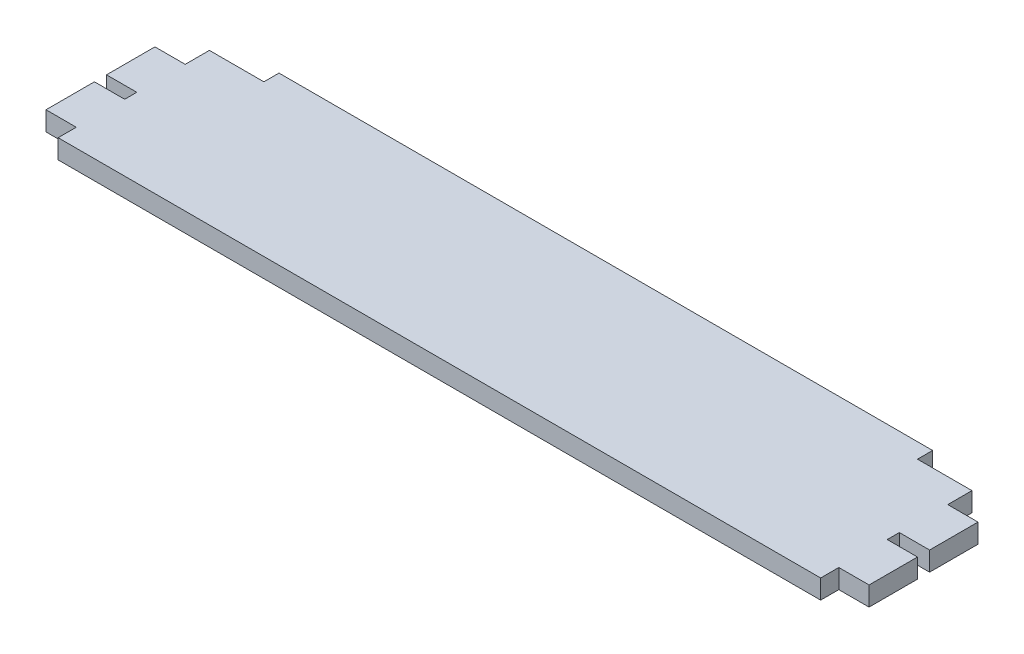
ISO-10303-21;
HEADER;
FILE_DESCRIPTION(('STEP AP214'),'2;1');
FILE_NAME('part.step','',(''),(''),'','','');
FILE_SCHEMA(('AUTOMOTIVE_DESIGN { 1 0 10303 214 1 1 1 1 }'));
ENDSEC;
DATA;
#1=APPLICATION_CONTEXT('core data for automotive mechanical design processes');
#2=APPLICATION_PROTOCOL_DEFINITION('international standard','automotive_design',2000,#1);
#3=PRODUCT_CONTEXT('',#1,'mechanical');
#4=PRODUCT('Part','Part','',(#3));
#5=PRODUCT_RELATED_PRODUCT_CATEGORY('part','',(#4));
#6=PRODUCT_DEFINITION_FORMATION('','',#4);
#7=PRODUCT_DEFINITION_CONTEXT('part definition',#1,'design');
#8=PRODUCT_DEFINITION('design','',#6,#7);
#9=PRODUCT_DEFINITION_SHAPE('','',#8);
#10=(LENGTH_UNIT() NAMED_UNIT(*) SI_UNIT(.MILLI.,.METRE.));
#11=(NAMED_UNIT(*) PLANE_ANGLE_UNIT() SI_UNIT($,.RADIAN.));
#12=(NAMED_UNIT(*) SI_UNIT($,.STERADIAN.) SOLID_ANGLE_UNIT());
#13=UNCERTAINTY_MEASURE_WITH_UNIT(LENGTH_MEASURE(1.E-05),#10,'distance_accuracy_value','');
#14=(GEOMETRIC_REPRESENTATION_CONTEXT(3) GLOBAL_UNCERTAINTY_ASSIGNED_CONTEXT((#13)) GLOBAL_UNIT_ASSIGNED_CONTEXT((#10,
#11,#12)) REPRESENTATION_CONTEXT('',''));
#15=CARTESIAN_POINT('',(0.,0.,0.));
#16=DIRECTION('',(0.,0.,1.));
#17=DIRECTION('',(1.,0.,0.));
#18=AXIS2_PLACEMENT_3D('',#15,#16,#17);
#19=CARTESIAN_POINT('',(-68.,3.175,0.));
#20=DIRECTION('',(1.,0.,0.));
#21=DIRECTION('',(0.,0.,-1.));
#22=AXIS2_PLACEMENT_3D('',#19,#20,#21);
#23=PLANE('',#22);
#24=DIRECTION('',(0.,1.,0.));
#25=VECTOR('',#24,1.);
#26=CARTESIAN_POINT('',(-68.,0.,-0.999999999999989));
#27=LINE('',#26,#25);
#28=CARTESIAN_POINT('',(-68.,0.,-0.999999999999989));
#29=VERTEX_POINT('',#28);
#30=CARTESIAN_POINT('',(-68.,3.175,-0.999999999999989));
#31=VERTEX_POINT('',#30);
#32=EDGE_CURVE('E236',#29,#31,#27,.T.);
#33=ORIENTED_EDGE('',*,*,#32,.T.);
#34=DIRECTION('',(0.,0.,1.));
#35=VECTOR('',#34,1.);
#36=CARTESIAN_POINT('',(-68.,3.175,0.));
#37=LINE('',#36,#35);
#38=CARTESIAN_POINT('',(-68.,3.175,-8.99999999999999));
#39=VERTEX_POINT('',#38);
#40=EDGE_CURVE('E303',#39,#31,#37,.T.);
#41=ORIENTED_EDGE('',*,*,#40,.F.);
#42=DIRECTION('',(0.,-1.,0.));
#43=VECTOR('',#42,1.);
#44=CARTESIAN_POINT('',(-68.,3.175,-8.99999999999999));
#45=LINE('',#44,#43);
#46=CARTESIAN_POINT('',(-68.,0.,-8.99999999999999));
#47=VERTEX_POINT('',#46);
#48=EDGE_CURVE('E11',#39,#47,#45,.T.);
#49=ORIENTED_EDGE('',*,*,#48,.T.);
#50=DIRECTION('',(0.,0.,1.));
#51=VECTOR('',#50,1.);
#52=CARTESIAN_POINT('',(-68.,0.,0.));
#53=LINE('',#52,#51);
#54=EDGE_CURVE('E332',#47,#29,#53,.T.);
#55=ORIENTED_EDGE('',*,*,#54,.T.);
#56=EDGE_LOOP('',(#33,#41,#49,#55));
#57=FACE_BOUND('',#56,.T.);
#58=ADVANCED_FACE('F39',(#57),#23,.F.);
#59=CARTESIAN_POINT('',(68.,3.175,0.));
#60=DIRECTION('',(1.,0.,0.));
#61=DIRECTION('',(0.,0.,-1.));
#62=AXIS2_PLACEMENT_3D('',#59,#60,#61);
#63=PLANE('',#62);
#64=DIRECTION('',(0.,0.,1.));
#65=VECTOR('',#64,1.);
#66=CARTESIAN_POINT('',(68.,0.,0.));
#67=LINE('',#66,#65);
#68=CARTESIAN_POINT('',(68.,0.,0.999999999999997));
#69=VERTEX_POINT('',#68);
#70=CARTESIAN_POINT('',(68.,0.,9.));
#71=VERTEX_POINT('',#70);
#72=EDGE_CURVE('E348',#69,#71,#67,.T.);
#73=ORIENTED_EDGE('',*,*,#72,.F.);
#74=DIRECTION('',(0.,1.,0.));
#75=VECTOR('',#74,1.);
#76=CARTESIAN_POINT('',(68.,0.,0.999999999999997));
#77=LINE('',#76,#75);
#78=CARTESIAN_POINT('',(68.,3.175,0.999999999999997));
#79=VERTEX_POINT('',#78);
#80=EDGE_CURVE('E246',#69,#79,#77,.T.);
#81=ORIENTED_EDGE('',*,*,#80,.T.);
#82=DIRECTION('',(0.,0.,1.));
#83=VECTOR('',#82,1.);
#84=CARTESIAN_POINT('',(68.,3.175,0.));
#85=LINE('',#84,#83);
#86=CARTESIAN_POINT('',(68.,3.175,9.));
#87=VERTEX_POINT('',#86);
#88=EDGE_CURVE('E321',#79,#87,#85,.T.);
#89=ORIENTED_EDGE('',*,*,#88,.T.);
#90=DIRECTION('',(0.,-1.,0.));
#91=VECTOR('',#90,1.);
#92=CARTESIAN_POINT('',(68.,3.175,9.));
#93=LINE('',#92,#91);
#94=EDGE_CURVE('E361',#87,#71,#93,.T.);
#95=ORIENTED_EDGE('',*,*,#94,.T.);
#96=EDGE_LOOP('',(#73,#81,#89,#95));
#97=FACE_BOUND('',#96,.T.);
#98=ADVANCED_FACE('F425',(#97),#63,.T.);
#99=CARTESIAN_POINT('',(0.,3.175,0.));
#100=DIRECTION('',(0.,1.,0.));
#101=DIRECTION('',(0.,0.,1.));
#102=AXIS2_PLACEMENT_3D('',#99,#100,#101);
#103=PLANE('',#102);
#104=DIRECTION('',(1.,0.,0.));
#105=VECTOR('',#104,1.);
#106=CARTESIAN_POINT('',(-68.,3.175,1.00000000000001));
#107=LINE('',#106,#105);
#108=CARTESIAN_POINT('',(-68.,3.175,1.00000000000001));
#109=VERTEX_POINT('',#108);
#110=CARTESIAN_POINT('',(-63.,3.175,1.00000000000001));
#111=VERTEX_POINT('',#110);
#112=EDGE_CURVE('E216',#109,#111,#107,.T.);
#113=ORIENTED_EDGE('',*,*,#112,.F.);
#114=CARTESIAN_POINT('',(-68.,3.175,9.00000000000001));
#115=VERTEX_POINT('',#114);
#116=EDGE_CURVE('E301',#109,#115,#37,.T.);
#117=ORIENTED_EDGE('',*,*,#116,.T.);
#118=DIRECTION('',(-1.,0.,0.));
#119=VECTOR('',#118,1.);
#120=CARTESIAN_POINT('',(0.,3.175,9.00000000000005));
#121=LINE('',#120,#119);
#122=CARTESIAN_POINT('',(-63.,3.175,9.00000000000001));
#123=VERTEX_POINT('',#122);
#124=EDGE_CURVE('E306',#123,#115,#121,.T.);
#125=ORIENTED_EDGE('',*,*,#124,.F.);
#126=DIRECTION('',(0.,0.,-1.));
#127=VECTOR('',#126,1.);
#128=CARTESIAN_POINT('',(-63.,3.175,0.));
#129=LINE('',#128,#127);
#130=CARTESIAN_POINT('',(-63.,3.175,12.));
#131=VERTEX_POINT('',#130);
#132=EDGE_CURVE('E309',#131,#123,#129,.T.);
#133=ORIENTED_EDGE('',*,*,#132,.F.);
#134=DIRECTION('',(1.,0.,0.));
#135=VECTOR('',#134,1.);
#136=CARTESIAN_POINT('',(0.,3.175,12.));
#137=LINE('',#136,#135);
#138=CARTESIAN_POINT('',(63.,3.175,12.));
#139=VERTEX_POINT('',#138);
#140=EDGE_CURVE('E312',#131,#139,#137,.T.);
#141=ORIENTED_EDGE('',*,*,#140,.T.);
#142=DIRECTION('',(0.,0.,-1.));
#143=VECTOR('',#142,1.);
#144=CARTESIAN_POINT('',(63.,3.175,0.));
#145=LINE('',#144,#143);
#146=CARTESIAN_POINT('',(63.,3.175,9.));
#147=VERTEX_POINT('',#146);
#148=EDGE_CURVE('E315',#139,#147,#145,.T.);
#149=ORIENTED_EDGE('',*,*,#148,.T.);
#150=DIRECTION('',(1.,0.,0.));
#151=VECTOR('',#150,1.);
#152=CARTESIAN_POINT('',(0.,3.175,9.));
#153=LINE('',#152,#151);
#154=EDGE_CURVE('E317',#147,#87,#153,.T.);
#155=ORIENTED_EDGE('',*,*,#154,.T.);
#156=ORIENTED_EDGE('',*,*,#88,.F.);
#157=DIRECTION('',(-1.,0.,0.));
#158=VECTOR('',#157,1.);
#159=CARTESIAN_POINT('',(68.,3.175,0.999999999999997));
#160=LINE('',#159,#158);
#161=CARTESIAN_POINT('',(63.,3.175,0.999999999999998));
#162=VERTEX_POINT('',#161);
#163=EDGE_CURVE('E231',#79,#162,#160,.T.);
#164=ORIENTED_EDGE('',*,*,#163,.T.);
#165=DIRECTION('',(0.,0.,1.));
#166=VECTOR('',#165,1.);
#167=CARTESIAN_POINT('',(63.,3.175,-1.));
#168=LINE('',#167,#166);
#169=CARTESIAN_POINT('',(63.,3.175,-1.));
#170=VERTEX_POINT('',#169);
#171=EDGE_CURVE('E253',#170,#162,#168,.T.);
#172=ORIENTED_EDGE('',*,*,#171,.F.);
#173=DIRECTION('',(-1.,0.,0.));
#174=VECTOR('',#173,1.);
#175=CARTESIAN_POINT('',(68.,3.175,-1.));
#176=LINE('',#175,#174);
#177=CARTESIAN_POINT('',(68.,3.175,-1.));
#178=VERTEX_POINT('',#177);
#179=EDGE_CURVE('E250',#178,#170,#176,.T.);
#180=ORIENTED_EDGE('',*,*,#179,.F.);
#181=CARTESIAN_POINT('',(68.,3.175,-9.));
#182=VERTEX_POINT('',#181);
#183=EDGE_CURVE('E322',#182,#178,#85,.T.);
#184=ORIENTED_EDGE('',*,*,#183,.F.);
#185=DIRECTION('',(1.,0.,0.));
#186=VECTOR('',#185,1.);
#187=CARTESIAN_POINT('',(0.,3.175,-8.99999999999998));
#188=LINE('',#187,#186);
#189=CARTESIAN_POINT('',(63.,3.175,-9.));
#190=VERTEX_POINT('',#189);
#191=EDGE_CURVE('E325',#190,#182,#188,.T.);
#192=ORIENTED_EDGE('',*,*,#191,.F.);
#193=CARTESIAN_POINT('',(63.,3.175,-13.));
#194=VERTEX_POINT('',#193);
#195=EDGE_CURVE('E318',#190,#194,#145,.T.);
#196=ORIENTED_EDGE('',*,*,#195,.T.);
#197=DIRECTION('',(1.,0.,0.));
#198=VECTOR('',#197,1.);
#199=CARTESIAN_POINT('',(63.,3.175,-13.));
#200=LINE('',#199,#198);
#201=CARTESIAN_POINT('',(54.,3.175,-13.));
#202=VERTEX_POINT('',#201);
#203=EDGE_CURVE('E289',#202,#194,#200,.T.);
#204=ORIENTED_EDGE('',*,*,#203,.F.);
#205=DIRECTION('',(0.,0.,1.));
#206=VECTOR('',#205,1.);
#207=CARTESIAN_POINT('',(54.,3.175,-15.5));
#208=LINE('',#207,#206);
#209=CARTESIAN_POINT('',(54.,3.175,-15.5));
#210=VERTEX_POINT('',#209);
#211=EDGE_CURVE('E274',#210,#202,#208,.T.);
#212=ORIENTED_EDGE('',*,*,#211,.F.);
#213=DIRECTION('',(1.,0.,0.));
#214=VECTOR('',#213,1.);
#215=CARTESIAN_POINT('',(-63.,3.175,-15.5));
#216=LINE('',#215,#214);
#217=CARTESIAN_POINT('',(-54.,3.175,-15.5));
#218=VERTEX_POINT('',#217);
#219=EDGE_CURVE('E331',#218,#210,#216,.T.);
#220=ORIENTED_EDGE('',*,*,#219,.F.);
#221=DIRECTION('',(0.,0.,-1.));
#222=VECTOR('',#221,1.);
#223=CARTESIAN_POINT('',(-54.,3.175,-15.5));
#224=LINE('',#223,#222);
#225=CARTESIAN_POINT('',(-54.,3.175,-13.));
#226=VERTEX_POINT('',#225);
#227=EDGE_CURVE('E267',#226,#218,#224,.T.);
#228=ORIENTED_EDGE('',*,*,#227,.F.);
#229=DIRECTION('',(1.,0.,0.));
#230=VECTOR('',#229,1.);
#231=CARTESIAN_POINT('',(-63.,3.175,-13.));
#232=LINE('',#231,#230);
#233=CARTESIAN_POINT('',(-63.,3.175,-13.));
#234=VERTEX_POINT('',#233);
#235=EDGE_CURVE('E271',#234,#226,#232,.T.);
#236=ORIENTED_EDGE('',*,*,#235,.F.);
#237=CARTESIAN_POINT('',(-63.,3.175,-8.99999999999999));
#238=VERTEX_POINT('',#237);
#239=EDGE_CURVE('E313',#238,#234,#129,.T.);
#240=ORIENTED_EDGE('',*,*,#239,.F.);
#241=DIRECTION('',(-1.,0.,0.));
#242=VECTOR('',#241,1.);
#243=CARTESIAN_POINT('',(0.,3.175,-8.99999999999997));
#244=LINE('',#243,#242);
#245=EDGE_CURVE('E298',#238,#39,#244,.T.);
#246=ORIENTED_EDGE('',*,*,#245,.T.);
#247=ORIENTED_EDGE('',*,*,#40,.T.);
#248=DIRECTION('',(1.,0.,0.));
#249=VECTOR('',#248,1.);
#250=CARTESIAN_POINT('',(-68.,3.175,-0.999999999999989));
#251=LINE('',#250,#249);
#252=CARTESIAN_POINT('',(-63.,3.175,-0.999999999999985));
#253=VERTEX_POINT('',#252);
#254=EDGE_CURVE('E223',#31,#253,#251,.T.);
#255=ORIENTED_EDGE('',*,*,#254,.T.);
#256=DIRECTION('',(0.,0.,1.));
#257=VECTOR('',#256,1.);
#258=CARTESIAN_POINT('',(-63.,3.175,-0.999999999999985));
#259=LINE('',#258,#257);
#260=EDGE_CURVE('E226',#253,#111,#259,.T.);
#261=ORIENTED_EDGE('',*,*,#260,.T.);
#262=EDGE_LOOP('',(#113,#117,#125,#133,#141,#149,#155,#156,#164,#172,#180,#184,#192,#196,#204,
#212,#220,#228,#236,#240,#246,#247,#255,#261));
#263=FACE_BOUND('',#262,.T.);
#264=ADVANCED_FACE('F387',(#263),#103,.T.);
#265=CARTESIAN_POINT('',(0.,0.,0.));
#266=DIRECTION('',(0.,1.,0.));
#267=DIRECTION('',(0.,0.,1.));
#268=AXIS2_PLACEMENT_3D('',#265,#266,#267);
#269=PLANE('',#268);
#270=CARTESIAN_POINT('',(-68.,0.,1.00000000000001));
#271=VERTEX_POINT('',#270);
#272=CARTESIAN_POINT('',(-68.,0.,9.00000000000001));
#273=VERTEX_POINT('',#272);
#274=EDGE_CURVE('E222',#271,#273,#53,.T.);
#275=ORIENTED_EDGE('',*,*,#274,.F.);
#276=DIRECTION('',(1.,0.,0.));
#277=VECTOR('',#276,1.);
#278=CARTESIAN_POINT('',(-68.,0.,1.00000000000001));
#279=LINE('',#278,#277);
#280=CARTESIAN_POINT('',(-63.,0.,1.00000000000001));
#281=VERTEX_POINT('',#280);
#282=EDGE_CURVE('E210',#271,#281,#279,.T.);
#283=ORIENTED_EDGE('',*,*,#282,.T.);
#284=DIRECTION('',(0.,0.,1.));
#285=VECTOR('',#284,1.);
#286=CARTESIAN_POINT('',(-63.,0.,-0.999999999999985));
#287=LINE('',#286,#285);
#288=CARTESIAN_POINT('',(-63.,0.,-0.999999999999985));
#289=VERTEX_POINT('',#288);
#290=EDGE_CURVE('E201',#289,#281,#287,.T.);
#291=ORIENTED_EDGE('',*,*,#290,.F.);
#292=DIRECTION('',(1.,0.,0.));
#293=VECTOR('',#292,1.);
#294=CARTESIAN_POINT('',(-68.,0.,-0.999999999999989));
#295=LINE('',#294,#293);
#296=EDGE_CURVE('E209',#29,#289,#295,.T.);
#297=ORIENTED_EDGE('',*,*,#296,.F.);
#298=ORIENTED_EDGE('',*,*,#54,.F.);
#299=DIRECTION('',(-1.,0.,0.));
#300=VECTOR('',#299,1.);
#301=CARTESIAN_POINT('',(0.,0.,-8.99999999999997));
#302=LINE('',#301,#300);
#303=CARTESIAN_POINT('',(-63.,0.,-8.99999999999999));
#304=VERTEX_POINT('',#303);
#305=EDGE_CURVE('E328',#304,#47,#302,.T.);
#306=ORIENTED_EDGE('',*,*,#305,.F.);
#307=DIRECTION('',(0.,0.,-1.));
#308=VECTOR('',#307,1.);
#309=CARTESIAN_POINT('',(-63.,0.,0.));
#310=LINE('',#309,#308);
#311=CARTESIAN_POINT('',(-63.,0.,-13.));
#312=VERTEX_POINT('',#311);
#313=EDGE_CURVE('E302',#304,#312,#310,.T.);
#314=ORIENTED_EDGE('',*,*,#313,.T.);
#315=DIRECTION('',(1.,0.,0.));
#316=VECTOR('',#315,1.);
#317=CARTESIAN_POINT('',(-63.,0.,-13.));
#318=LINE('',#317,#316);
#319=CARTESIAN_POINT('',(-54.,0.,-13.));
#320=VERTEX_POINT('',#319);
#321=EDGE_CURVE('E263',#312,#320,#318,.T.);
#322=ORIENTED_EDGE('',*,*,#321,.T.);
#323=DIRECTION('',(0.,0.,-1.));
#324=VECTOR('',#323,1.);
#325=CARTESIAN_POINT('',(-54.,0.,-15.5));
#326=LINE('',#325,#324);
#327=CARTESIAN_POINT('',(-54.,0.,-15.5));
#328=VERTEX_POINT('',#327);
#329=EDGE_CURVE('E266',#320,#328,#326,.T.);
#330=ORIENTED_EDGE('',*,*,#329,.T.);
#331=DIRECTION('',(1.,0.,0.));
#332=VECTOR('',#331,1.);
#333=CARTESIAN_POINT('',(-63.,0.,-15.5));
#334=LINE('',#333,#332);
#335=CARTESIAN_POINT('',(54.,0.,-15.5));
#336=VERTEX_POINT('',#335);
#337=EDGE_CURVE('E43',#328,#336,#334,.T.);
#338=ORIENTED_EDGE('',*,*,#337,.T.);
#339=DIRECTION('',(0.,0.,1.));
#340=VECTOR('',#339,1.);
#341=CARTESIAN_POINT('',(54.,0.,-15.5));
#342=LINE('',#341,#340);
#343=CARTESIAN_POINT('',(54.,0.,-13.));
#344=VERTEX_POINT('',#343);
#345=EDGE_CURVE('E291',#336,#344,#342,.T.);
#346=ORIENTED_EDGE('',*,*,#345,.T.);
#347=DIRECTION('',(1.,0.,0.));
#348=VECTOR('',#347,1.);
#349=CARTESIAN_POINT('',(63.,0.,-13.));
#350=LINE('',#349,#348);
#351=CARTESIAN_POINT('',(63.,0.,-13.));
#352=VERTEX_POINT('',#351);
#353=EDGE_CURVE('E284',#344,#352,#350,.T.);
#354=ORIENTED_EDGE('',*,*,#353,.T.);
#355=DIRECTION('',(0.,0.,-1.));
#356=VECTOR('',#355,1.);
#357=CARTESIAN_POINT('',(63.,0.,0.));
#358=LINE('',#357,#356);
#359=CARTESIAN_POINT('',(63.,0.,-9.));
#360=VERTEX_POINT('',#359);
#361=EDGE_CURVE('E345',#360,#352,#358,.T.);
#362=ORIENTED_EDGE('',*,*,#361,.F.);
#363=DIRECTION('',(1.,0.,0.));
#364=VECTOR('',#363,1.);
#365=CARTESIAN_POINT('',(0.,0.,-8.99999999999998));
#366=LINE('',#365,#364);
#367=CARTESIAN_POINT('',(68.,0.,-9.));
#368=VERTEX_POINT('',#367);
#369=EDGE_CURVE('E352',#360,#368,#366,.T.);
#370=ORIENTED_EDGE('',*,*,#369,.T.);
#371=CARTESIAN_POINT('',(68.,0.,-1.));
#372=VERTEX_POINT('',#371);
#373=EDGE_CURVE('E349',#368,#372,#67,.T.);
#374=ORIENTED_EDGE('',*,*,#373,.T.);
#375=DIRECTION('',(-1.,0.,0.));
#376=VECTOR('',#375,1.);
#377=CARTESIAN_POINT('',(68.,0.,-1.));
#378=LINE('',#377,#376);
#379=CARTESIAN_POINT('',(63.,0.,-1.));
#380=VERTEX_POINT('',#379);
#381=EDGE_CURVE('E249',#372,#380,#378,.T.);
#382=ORIENTED_EDGE('',*,*,#381,.T.);
#383=DIRECTION('',(0.,0.,1.));
#384=VECTOR('',#383,1.);
#385=CARTESIAN_POINT('',(63.,0.,-1.));
#386=LINE('',#385,#384);
#387=CARTESIAN_POINT('',(63.,0.,0.999999999999998));
#388=VERTEX_POINT('',#387);
#389=EDGE_CURVE('E64',#380,#388,#386,.T.);
#390=ORIENTED_EDGE('',*,*,#389,.T.);
#391=DIRECTION('',(-1.,0.,0.));
#392=VECTOR('',#391,1.);
#393=CARTESIAN_POINT('',(68.,0.,0.999999999999997));
#394=LINE('',#393,#392);
#395=EDGE_CURVE('E254',#69,#388,#394,.T.);
#396=ORIENTED_EDGE('',*,*,#395,.F.);
#397=ORIENTED_EDGE('',*,*,#72,.T.);
#398=DIRECTION('',(1.,0.,0.));
#399=VECTOR('',#398,1.);
#400=CARTESIAN_POINT('',(0.,0.,9.));
#401=LINE('',#400,#399);
#402=CARTESIAN_POINT('',(63.,0.,9.));
#403=VERTEX_POINT('',#402);
#404=EDGE_CURVE('E344',#403,#71,#401,.T.);
#405=ORIENTED_EDGE('',*,*,#404,.F.);
#406=CARTESIAN_POINT('',(63.,0.,12.));
#407=VERTEX_POINT('',#406);
#408=EDGE_CURVE('E342',#407,#403,#358,.T.);
#409=ORIENTED_EDGE('',*,*,#408,.F.);
#410=DIRECTION('',(1.,0.,0.));
#411=VECTOR('',#410,1.);
#412=CARTESIAN_POINT('',(0.,0.,12.));
#413=LINE('',#412,#411);
#414=CARTESIAN_POINT('',(-63.,0.,12.));
#415=VERTEX_POINT('',#414);
#416=EDGE_CURVE('E340',#415,#407,#413,.T.);
#417=ORIENTED_EDGE('',*,*,#416,.F.);
#418=CARTESIAN_POINT('',(-63.,0.,9.00000000000001));
#419=VERTEX_POINT('',#418);
#420=EDGE_CURVE('E337',#415,#419,#310,.T.);
#421=ORIENTED_EDGE('',*,*,#420,.T.);
#422=DIRECTION('',(-1.,0.,0.));
#423=VECTOR('',#422,1.);
#424=CARTESIAN_POINT('',(0.,0.,9.00000000000005));
#425=LINE('',#424,#423);
#426=EDGE_CURVE('E335',#419,#273,#425,.T.);
#427=ORIENTED_EDGE('',*,*,#426,.T.);
#428=EDGE_LOOP('',(#275,#283,#291,#297,#298,#306,#314,#322,#330,#338,#346,#354,#362,#370,#374,
#382,#390,#396,#397,#405,#409,#417,#421,#427));
#429=FACE_BOUND('',#428,.T.);
#430=ADVANCED_FACE('F220',(#429),#269,.F.);
#431=CARTESIAN_POINT('',(0.,3.175,-8.99999999999997));
#432=DIRECTION('',(0.,0.,1.));
#433=DIRECTION('',(1.,0.,0.));
#434=AXIS2_PLACEMENT_3D('',#431,#432,#433);
#435=PLANE('',#434);
#436=ORIENTED_EDGE('',*,*,#305,.T.);
#437=ORIENTED_EDGE('',*,*,#48,.F.);
#438=ORIENTED_EDGE('',*,*,#245,.F.);
#439=DIRECTION('',(0.,-1.,0.));
#440=VECTOR('',#439,1.);
#441=CARTESIAN_POINT('',(-63.,3.175,-8.99999999999999));
#442=LINE('',#441,#440);
#443=EDGE_CURVE('E355',#238,#304,#442,.T.);
#444=ORIENTED_EDGE('',*,*,#443,.T.);
#445=EDGE_LOOP('',(#436,#437,#438,#444));
#446=FACE_BOUND('',#445,.T.);
#447=ADVANCED_FACE('F439',(#446),#435,.F.);
#448=ORIENTED_EDGE('',*,*,#116,.F.);
#449=DIRECTION('',(0.,1.,0.));
#450=VECTOR('',#449,1.);
#451=CARTESIAN_POINT('',(-68.,0.,1.00000000000001));
#452=LINE('',#451,#450);
#453=EDGE_CURVE('E233',#271,#109,#452,.T.);
#454=ORIENTED_EDGE('',*,*,#453,.F.);
#455=ORIENTED_EDGE('',*,*,#274,.T.);
#456=DIRECTION('',(0.,-1.,0.));
#457=VECTOR('',#456,1.);
#458=CARTESIAN_POINT('',(-68.,3.175,9.00000000000001));
#459=LINE('',#458,#457);
#460=EDGE_CURVE('E48',#115,#273,#459,.T.);
#461=ORIENTED_EDGE('',*,*,#460,.F.);
#462=EDGE_LOOP('',(#448,#454,#455,#461));
#463=FACE_BOUND('',#462,.T.);
#464=ADVANCED_FACE('F428',(#463),#23,.F.);
#465=CARTESIAN_POINT('',(0.,3.175,9.00000000000005));
#466=DIRECTION('',(0.,0.,1.));
#467=DIRECTION('',(1.,0.,0.));
#468=AXIS2_PLACEMENT_3D('',#465,#466,#467);
#469=PLANE('',#468);
#470=ORIENTED_EDGE('',*,*,#426,.F.);
#471=DIRECTION('',(0.,-1.,0.));
#472=VECTOR('',#471,1.);
#473=CARTESIAN_POINT('',(-63.,3.175,9.00000000000001));
#474=LINE('',#473,#472);
#475=EDGE_CURVE('E372',#123,#419,#474,.T.);
#476=ORIENTED_EDGE('',*,*,#475,.F.);
#477=ORIENTED_EDGE('',*,*,#124,.T.);
#478=ORIENTED_EDGE('',*,*,#460,.T.);
#479=EDGE_LOOP('',(#470,#476,#477,#478));
#480=FACE_BOUND('',#479,.T.);
#481=ADVANCED_FACE('F438',(#480),#469,.T.);
#482=CARTESIAN_POINT('',(-63.,3.175,0.));
#483=DIRECTION('',(-1.,0.,0.));
#484=DIRECTION('',(0.,0.,1.));
#485=AXIS2_PLACEMENT_3D('',#482,#483,#484);
#486=PLANE('',#485);
#487=ORIENTED_EDGE('',*,*,#420,.F.);
#488=DIRECTION('',(0.,-1.,0.));
#489=VECTOR('',#488,1.);
#490=CARTESIAN_POINT('',(-63.,3.175,12.));
#491=LINE('',#490,#489);
#492=EDGE_CURVE('E370',#131,#415,#491,.T.);
#493=ORIENTED_EDGE('',*,*,#492,.F.);
#494=ORIENTED_EDGE('',*,*,#132,.T.);
#495=ORIENTED_EDGE('',*,*,#475,.T.);
#496=EDGE_LOOP('',(#487,#493,#494,#495));
#497=FACE_BOUND('',#496,.T.);
#498=ADVANCED_FACE('F446',(#497),#486,.T.);
#499=CARTESIAN_POINT('',(0.,3.175,12.));
#500=DIRECTION('',(0.,0.,-1.));
#501=DIRECTION('',(-1.,0.,0.));
#502=AXIS2_PLACEMENT_3D('',#499,#500,#501);
#503=PLANE('',#502);
#504=ORIENTED_EDGE('',*,*,#416,.T.);
#505=DIRECTION('',(0.,-1.,0.));
#506=VECTOR('',#505,1.);
#507=CARTESIAN_POINT('',(63.,3.175,12.));
#508=LINE('',#507,#506);
#509=EDGE_CURVE('E367',#139,#407,#508,.T.);
#510=ORIENTED_EDGE('',*,*,#509,.F.);
#511=ORIENTED_EDGE('',*,*,#140,.F.);
#512=ORIENTED_EDGE('',*,*,#492,.T.);
#513=EDGE_LOOP('',(#504,#510,#511,#512));
#514=FACE_BOUND('',#513,.T.);
#515=ADVANCED_FACE('F501',(#514),#503,.F.);
#516=CARTESIAN_POINT('',(63.,3.175,0.));
#517=DIRECTION('',(-1.,0.,0.));
#518=DIRECTION('',(0.,0.,1.));
#519=AXIS2_PLACEMENT_3D('',#516,#517,#518);
#520=PLANE('',#519);
#521=ORIENTED_EDGE('',*,*,#408,.T.);
#522=DIRECTION('',(0.,-1.,0.));
#523=VECTOR('',#522,1.);
#524=CARTESIAN_POINT('',(63.,3.175,9.));
#525=LINE('',#524,#523);
#526=EDGE_CURVE('E364',#147,#403,#525,.T.);
#527=ORIENTED_EDGE('',*,*,#526,.F.);
#528=ORIENTED_EDGE('',*,*,#148,.F.);
#529=ORIENTED_EDGE('',*,*,#509,.T.);
#530=EDGE_LOOP('',(#521,#527,#528,#529));
#531=FACE_BOUND('',#530,.T.);
#532=ADVANCED_FACE('F494',(#531),#520,.F.);
#533=CARTESIAN_POINT('',(0.,3.175,9.));
#534=DIRECTION('',(0.,0.,-1.));
#535=DIRECTION('',(-1.,0.,0.));
#536=AXIS2_PLACEMENT_3D('',#533,#534,#535);
#537=PLANE('',#536);
#538=ORIENTED_EDGE('',*,*,#404,.T.);
#539=ORIENTED_EDGE('',*,*,#94,.F.);
#540=ORIENTED_EDGE('',*,*,#154,.F.);
#541=ORIENTED_EDGE('',*,*,#526,.T.);
#542=EDGE_LOOP('',(#538,#539,#540,#541));
#543=FACE_BOUND('',#542,.T.);
#544=ADVANCED_FACE('F495',(#543),#537,.F.);
#545=DIRECTION('',(0.,1.,0.));
#546=VECTOR('',#545,1.);
#547=CARTESIAN_POINT('',(68.,0.,-1.));
#548=LINE('',#547,#546);
#549=EDGE_CURVE('E244',#372,#178,#548,.T.);
#550=ORIENTED_EDGE('',*,*,#549,.F.);
#551=ORIENTED_EDGE('',*,*,#373,.F.);
#552=DIRECTION('',(0.,-1.,0.));
#553=VECTOR('',#552,1.);
#554=CARTESIAN_POINT('',(68.,3.175,-9.));
#555=LINE('',#554,#553);
#556=EDGE_CURVE('E359',#182,#368,#555,.T.);
#557=ORIENTED_EDGE('',*,*,#556,.F.);
#558=ORIENTED_EDGE('',*,*,#183,.T.);
#559=EDGE_LOOP('',(#550,#551,#557,#558));
#560=FACE_BOUND('',#559,.T.);
#561=ADVANCED_FACE('F435',(#560),#63,.T.);
#562=CARTESIAN_POINT('',(0.,3.175,-8.99999999999998));
#563=DIRECTION('',(0.,0.,-1.));
#564=DIRECTION('',(-1.,0.,0.));
#565=AXIS2_PLACEMENT_3D('',#562,#563,#564);
#566=PLANE('',#565);
#567=ORIENTED_EDGE('',*,*,#369,.F.);
#568=DIRECTION('',(0.,-1.,0.));
#569=VECTOR('',#568,1.);
#570=CARTESIAN_POINT('',(63.,3.175,-9.));
#571=LINE('',#570,#569);
#572=EDGE_CURVE('E357',#190,#360,#571,.T.);
#573=ORIENTED_EDGE('',*,*,#572,.F.);
#574=ORIENTED_EDGE('',*,*,#191,.T.);
#575=ORIENTED_EDGE('',*,*,#556,.T.);
#576=EDGE_LOOP('',(#567,#573,#574,#575));
#577=FACE_BOUND('',#576,.T.);
#578=ADVANCED_FACE('F486',(#577),#566,.T.);
#579=ORIENTED_EDGE('',*,*,#361,.T.);
#580=DIRECTION('',(0.,1.,0.));
#581=VECTOR('',#580,1.);
#582=CARTESIAN_POINT('',(63.,0.,-13.));
#583=LINE('',#582,#581);
#584=EDGE_CURVE('E235',#352,#194,#583,.T.);
#585=ORIENTED_EDGE('',*,*,#584,.T.);
#586=ORIENTED_EDGE('',*,*,#195,.F.);
#587=ORIENTED_EDGE('',*,*,#572,.T.);
#588=EDGE_LOOP('',(#579,#585,#586,#587));
#589=FACE_BOUND('',#588,.T.);
#590=ADVANCED_FACE('F397',(#589),#520,.F.);
#591=DIRECTION('',(0.,1.,0.));
#592=VECTOR('',#591,1.);
#593=CARTESIAN_POINT('',(-63.,0.,-13.));
#594=LINE('',#593,#592);
#595=EDGE_CURVE('E270',#312,#234,#594,.T.);
#596=ORIENTED_EDGE('',*,*,#595,.F.);
#597=ORIENTED_EDGE('',*,*,#313,.F.);
#598=ORIENTED_EDGE('',*,*,#443,.F.);
#599=ORIENTED_EDGE('',*,*,#239,.T.);
#600=EDGE_LOOP('',(#596,#597,#598,#599));
#601=FACE_BOUND('',#600,.T.);
#602=ADVANCED_FACE('F405',(#601),#486,.T.);
#603=CARTESIAN_POINT('',(-63.,3.175,-15.5));
#604=DIRECTION('',(0.,0.,-1.));
#605=DIRECTION('',(-1.,0.,0.));
#606=AXIS2_PLACEMENT_3D('',#603,#604,#605);
#607=PLANE('',#606);
#608=DIRECTION('',(0.,1.,0.));
#609=VECTOR('',#608,1.);
#610=CARTESIAN_POINT('',(-54.,0.,-15.5));
#611=LINE('',#610,#609);
#612=EDGE_CURVE('E276',#328,#218,#611,.T.);
#613=ORIENTED_EDGE('',*,*,#612,.T.);
#614=ORIENTED_EDGE('',*,*,#219,.T.);
#615=DIRECTION('',(0.,1.,0.));
#616=VECTOR('',#615,1.);
#617=CARTESIAN_POINT('',(54.,0.,-15.5));
#618=LINE('',#617,#616);
#619=EDGE_CURVE('E282',#336,#210,#618,.T.);
#620=ORIENTED_EDGE('',*,*,#619,.F.);
#621=ORIENTED_EDGE('',*,*,#337,.F.);
#622=EDGE_LOOP('',(#613,#614,#620,#621));
#623=FACE_BOUND('',#622,.T.);
#624=ADVANCED_FACE('F41',(#623),#607,.T.);
#625=CARTESIAN_POINT('',(63.,0.,-13.));
#626=DIRECTION('',(0.,0.,1.));
#627=DIRECTION('',(1.,0.,0.));
#628=AXIS2_PLACEMENT_3D('',#625,#626,#627);
#629=PLANE('',#628);
#630=ORIENTED_EDGE('',*,*,#203,.T.);
#631=ORIENTED_EDGE('',*,*,#584,.F.);
#632=ORIENTED_EDGE('',*,*,#353,.F.);
#633=DIRECTION('',(0.,1.,0.));
#634=VECTOR('',#633,1.);
#635=CARTESIAN_POINT('',(54.,0.,-13.));
#636=LINE('',#635,#634);
#637=EDGE_CURVE('E285',#344,#202,#636,.T.);
#638=ORIENTED_EDGE('',*,*,#637,.T.);
#639=EDGE_LOOP('',(#630,#631,#632,#638));
#640=FACE_BOUND('',#639,.T.);
#641=ADVANCED_FACE('F393',(#640),#629,.F.);
#642=CARTESIAN_POINT('',(54.,0.,-15.5));
#643=DIRECTION('',(-1.,0.,0.));
#644=DIRECTION('',(0.,0.,1.));
#645=AXIS2_PLACEMENT_3D('',#642,#643,#644);
#646=PLANE('',#645);
#647=ORIENTED_EDGE('',*,*,#211,.T.);
#648=ORIENTED_EDGE('',*,*,#637,.F.);
#649=ORIENTED_EDGE('',*,*,#345,.F.);
#650=ORIENTED_EDGE('',*,*,#619,.T.);
#651=EDGE_LOOP('',(#647,#648,#649,#650));
#652=FACE_BOUND('',#651,.T.);
#653=ADVANCED_FACE('F384',(#652),#646,.F.);
#654=CARTESIAN_POINT('',(-54.,0.,-15.5));
#655=DIRECTION('',(1.,0.,0.));
#656=DIRECTION('',(0.,0.,-1.));
#657=AXIS2_PLACEMENT_3D('',#654,#655,#656);
#658=PLANE('',#657);
#659=ORIENTED_EDGE('',*,*,#227,.T.);
#660=ORIENTED_EDGE('',*,*,#612,.F.);
#661=ORIENTED_EDGE('',*,*,#329,.F.);
#662=DIRECTION('',(0.,1.,0.));
#663=VECTOR('',#662,1.);
#664=CARTESIAN_POINT('',(-54.,0.,-13.));
#665=LINE('',#664,#663);
#666=EDGE_CURVE('E279',#320,#226,#665,.T.);
#667=ORIENTED_EDGE('',*,*,#666,.T.);
#668=EDGE_LOOP('',(#659,#660,#661,#667));
#669=FACE_BOUND('',#668,.T.);
#670=ADVANCED_FACE('F413',(#669),#658,.F.);
#671=CARTESIAN_POINT('',(-63.,0.,-13.));
#672=DIRECTION('',(0.,0.,1.));
#673=DIRECTION('',(1.,0.,0.));
#674=AXIS2_PLACEMENT_3D('',#671,#672,#673);
#675=PLANE('',#674);
#676=ORIENTED_EDGE('',*,*,#235,.T.);
#677=ORIENTED_EDGE('',*,*,#666,.F.);
#678=ORIENTED_EDGE('',*,*,#321,.F.);
#679=ORIENTED_EDGE('',*,*,#595,.T.);
#680=EDGE_LOOP('',(#676,#677,#678,#679));
#681=FACE_BOUND('',#680,.T.);
#682=ADVANCED_FACE('F411',(#681),#675,.F.);
#683=CARTESIAN_POINT('',(68.,0.,0.999999999999997));
#684=DIRECTION('',(0.,0.,-1.));
#685=DIRECTION('',(-1.,0.,0.));
#686=AXIS2_PLACEMENT_3D('',#683,#684,#685);
#687=PLANE('',#686);
#688=ORIENTED_EDGE('',*,*,#163,.F.);
#689=ORIENTED_EDGE('',*,*,#80,.F.);
#690=ORIENTED_EDGE('',*,*,#395,.T.);
#691=DIRECTION('',(0.,1.,0.));
#692=VECTOR('',#691,1.);
#693=CARTESIAN_POINT('',(63.,0.,0.999999999999998));
#694=LINE('',#693,#692);
#695=EDGE_CURVE('E240',#388,#162,#694,.T.);
#696=ORIENTED_EDGE('',*,*,#695,.T.);
#697=EDGE_LOOP('',(#688,#689,#690,#696));
#698=FACE_BOUND('',#697,.T.);
#699=ADVANCED_FACE('F420',(#698),#687,.T.);
#700=CARTESIAN_POINT('',(63.,0.,-1.));
#701=DIRECTION('',(-1.,0.,0.));
#702=DIRECTION('',(0.,0.,1.));
#703=AXIS2_PLACEMENT_3D('',#700,#701,#702);
#704=PLANE('',#703);
#705=ORIENTED_EDGE('',*,*,#171,.T.);
#706=ORIENTED_EDGE('',*,*,#695,.F.);
#707=ORIENTED_EDGE('',*,*,#389,.F.);
#708=DIRECTION('',(0.,1.,0.));
#709=VECTOR('',#708,1.);
#710=CARTESIAN_POINT('',(63.,0.,-1.));
#711=LINE('',#710,#709);
#712=EDGE_CURVE('E242',#380,#170,#711,.T.);
#713=ORIENTED_EDGE('',*,*,#712,.T.);
#714=EDGE_LOOP('',(#705,#706,#707,#713));
#715=FACE_BOUND('',#714,.T.);
#716=ADVANCED_FACE('F469',(#715),#704,.F.);
#717=CARTESIAN_POINT('',(68.,0.,-1.));
#718=DIRECTION('',(0.,0.,-1.));
#719=DIRECTION('',(-1.,0.,0.));
#720=AXIS2_PLACEMENT_3D('',#717,#718,#719);
#721=PLANE('',#720);
#722=ORIENTED_EDGE('',*,*,#179,.T.);
#723=ORIENTED_EDGE('',*,*,#712,.F.);
#724=ORIENTED_EDGE('',*,*,#381,.F.);
#725=ORIENTED_EDGE('',*,*,#549,.T.);
#726=EDGE_LOOP('',(#722,#723,#724,#725));
#727=FACE_BOUND('',#726,.T.);
#728=ADVANCED_FACE('F464',(#727),#721,.F.);
#729=CARTESIAN_POINT('',(-68.,0.,1.00000000000001));
#730=DIRECTION('',(0.,0.,1.));
#731=DIRECTION('',(1.,0.,0.));
#732=AXIS2_PLACEMENT_3D('',#729,#730,#731);
#733=PLANE('',#732);
#734=ORIENTED_EDGE('',*,*,#112,.T.);
#735=DIRECTION('',(0.,1.,0.));
#736=VECTOR('',#735,1.);
#737=CARTESIAN_POINT('',(-63.,0.,1.00000000000001));
#738=LINE('',#737,#736);
#739=EDGE_CURVE('E204',#281,#111,#738,.T.);
#740=ORIENTED_EDGE('',*,*,#739,.F.);
#741=ORIENTED_EDGE('',*,*,#282,.F.);
#742=ORIENTED_EDGE('',*,*,#453,.T.);
#743=EDGE_LOOP('',(#734,#740,#741,#742));
#744=FACE_BOUND('',#743,.T.);
#745=ADVANCED_FACE('F213',(#744),#733,.F.);
#746=CARTESIAN_POINT('',(-68.,0.,-0.999999999999989));
#747=DIRECTION('',(0.,0.,1.));
#748=DIRECTION('',(1.,0.,0.));
#749=AXIS2_PLACEMENT_3D('',#746,#747,#748);
#750=PLANE('',#749);
#751=ORIENTED_EDGE('',*,*,#254,.F.);
#752=ORIENTED_EDGE('',*,*,#32,.F.);
#753=ORIENTED_EDGE('',*,*,#296,.T.);
#754=DIRECTION('',(0.,1.,0.));
#755=VECTOR('',#754,1.);
#756=CARTESIAN_POINT('',(-63.,0.,-0.999999999999985));
#757=LINE('',#756,#755);
#758=EDGE_CURVE('E56',#289,#253,#757,.T.);
#759=ORIENTED_EDGE('',*,*,#758,.T.);
#760=EDGE_LOOP('',(#751,#752,#753,#759));
#761=FACE_BOUND('',#760,.T.);
#762=ADVANCED_FACE('F455',(#761),#750,.T.);
#763=CARTESIAN_POINT('',(-63.,0.,-0.999999999999985));
#764=DIRECTION('',(-1.,0.,0.));
#765=DIRECTION('',(0.,0.,1.));
#766=AXIS2_PLACEMENT_3D('',#763,#764,#765);
#767=PLANE('',#766);
#768=ORIENTED_EDGE('',*,*,#260,.F.);
#769=ORIENTED_EDGE('',*,*,#758,.F.);
#770=ORIENTED_EDGE('',*,*,#290,.T.);
#771=ORIENTED_EDGE('',*,*,#739,.T.);
#772=EDGE_LOOP('',(#768,#769,#770,#771));
#773=FACE_BOUND('',#772,.T.);
#774=ADVANCED_FACE('F203',(#773),#767,.T.);
#775=CLOSED_SHELL('',(#58,#98,#264,#430,#447,#464,#481,#498,#515,#532,#544,#561,#578,#590,#602,
#624,#641,#653,#670,#682,#699,#716,#728,#745,#762,#774));
#776=MANIFOLD_SOLID_BREP('B2',#775);
#777=ADVANCED_BREP_SHAPE_REPRESENTATION('',(#18,#776),#14);
#778=SHAPE_DEFINITION_REPRESENTATION(#9,#777);
ENDSEC;
END-ISO-10303-21;
